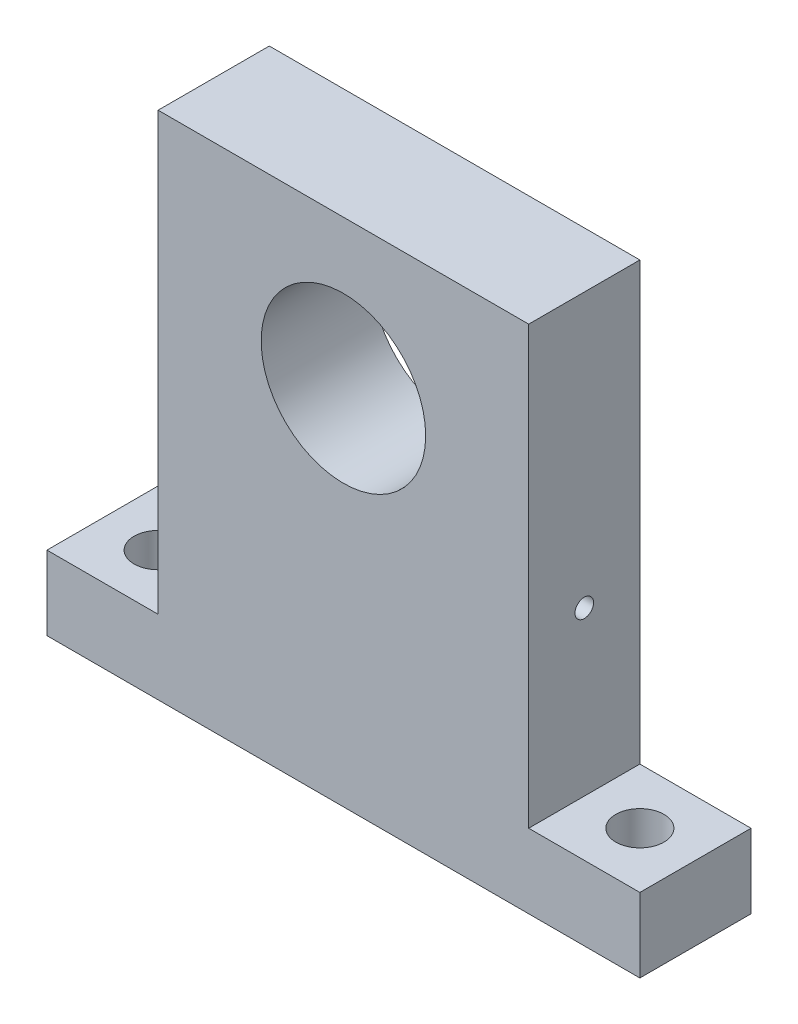
ISO-10303-21;
HEADER;
FILE_DESCRIPTION(('STEP AP214'),'2;1');
FILE_NAME('part.step','',(''),(''),'','','');
FILE_SCHEMA(('AUTOMOTIVE_DESIGN { 1 0 10303 214 1 1 1 1 }'));
ENDSEC;
DATA;
#1=APPLICATION_CONTEXT('core data for automotive mechanical design processes');
#2=APPLICATION_PROTOCOL_DEFINITION('international standard','automotive_design',2000,#1);
#3=PRODUCT_CONTEXT('',#1,'mechanical');
#4=PRODUCT('Part','Part','',(#3));
#5=PRODUCT_RELATED_PRODUCT_CATEGORY('part','',(#4));
#6=PRODUCT_DEFINITION_FORMATION('','',#4);
#7=PRODUCT_DEFINITION_CONTEXT('part definition',#1,'design');
#8=PRODUCT_DEFINITION('design','',#6,#7);
#9=PRODUCT_DEFINITION_SHAPE('','',#8);
#10=(LENGTH_UNIT() NAMED_UNIT(*) SI_UNIT(.MILLI.,.METRE.));
#11=(NAMED_UNIT(*) PLANE_ANGLE_UNIT() SI_UNIT($,.RADIAN.));
#12=(NAMED_UNIT(*) SI_UNIT($,.STERADIAN.) SOLID_ANGLE_UNIT());
#13=UNCERTAINTY_MEASURE_WITH_UNIT(LENGTH_MEASURE(1.E-05),#10,'distance_accuracy_value','');
#14=(GEOMETRIC_REPRESENTATION_CONTEXT(3) GLOBAL_UNCERTAINTY_ASSIGNED_CONTEXT((#13)) GLOBAL_UNIT_ASSIGNED_CONTEXT((#10,
#11,#12)) REPRESENTATION_CONTEXT('',''));
#15=CARTESIAN_POINT('',(0.,0.,0.));
#16=DIRECTION('',(0.,0.,1.));
#17=DIRECTION('',(1.,0.,0.));
#18=AXIS2_PLACEMENT_3D('',#15,#16,#17);
#19=CARTESIAN_POINT('',(4.44089209850063E-13,1.38777878078145E-13,15.0000000000001));
#20=DIRECTION('',(0.,0.,1.));
#21=DIRECTION('',(1.,0.,0.));
#22=AXIS2_PLACEMENT_3D('',#19,#20,#21);
#23=PLANE('',#22);
#24=DIRECTION('',(0.,1.,0.));
#25=VECTOR('',#24,1.);
#26=CARTESIAN_POINT('',(40.0000000000001,1.38777878078145E-13,15.));
#27=LINE('',#26,#25);
#28=CARTESIAN_POINT('',(40.0000000000001,1.38777878078145E-13,15.));
#29=VERTEX_POINT('',#28);
#30=CARTESIAN_POINT('',(40.0000000000005,10.0000000000001,15.));
#31=VERTEX_POINT('',#30);
#32=EDGE_CURVE('E153',#29,#31,#27,.T.);
#33=ORIENTED_EDGE('',*,*,#32,.T.);
#34=DIRECTION('',(-0.999999999999999,0.,0.));
#35=VECTOR('',#34,1.);
#36=CARTESIAN_POINT('',(40.0000000000005,10.0000000000001,15.));
#37=LINE('',#36,#35);
#38=CARTESIAN_POINT('',(25.0000000000001,9.99999999999998,14.9999999999999));
#39=VERTEX_POINT('',#38);
#40=EDGE_CURVE('E101',#31,#39,#37,.T.);
#41=ORIENTED_EDGE('',*,*,#40,.T.);
#42=DIRECTION('',(0.,1.,0.));
#43=VECTOR('',#42,1.);
#44=CARTESIAN_POINT('',(25.0000000000001,9.99999999999998,14.9999999999999));
#45=LINE('',#44,#43);
#46=CARTESIAN_POINT('',(25.0000000000001,68.9056000000001,14.9999999999999));
#47=VERTEX_POINT('',#46);
#48=EDGE_CURVE('E168',#39,#47,#45,.T.);
#49=ORIENTED_EDGE('',*,*,#48,.T.);
#50=DIRECTION('',(-1.,0.,0.));
#51=VECTOR('',#50,1.);
#52=CARTESIAN_POINT('',(25.0000000000001,68.9056000000001,14.9999999999999));
#53=LINE('',#52,#51);
#54=CARTESIAN_POINT('',(-24.9999999999998,68.9056000000001,14.9999999999998));
#55=VERTEX_POINT('',#54);
#56=EDGE_CURVE('E181',#47,#55,#53,.T.);
#57=ORIENTED_EDGE('',*,*,#56,.T.);
#58=DIRECTION('',(0.,-1.,0.));
#59=VECTOR('',#58,1.);
#60=CARTESIAN_POINT('',(-24.9999999999998,68.9056000000001,14.9999999999998));
#61=LINE('',#60,#59);
#62=CARTESIAN_POINT('',(-24.9999999999999,10.0000000000001,15.0000000000002));
#63=VERTEX_POINT('',#62);
#64=EDGE_CURVE('E120',#55,#63,#61,.T.);
#65=ORIENTED_EDGE('',*,*,#64,.T.);
#66=DIRECTION('',(-1.,0.,0.));
#67=VECTOR('',#66,1.);
#68=CARTESIAN_POINT('',(-24.9999999999999,10.0000000000001,15.0000000000002));
#69=LINE('',#68,#67);
#70=CARTESIAN_POINT('',(-39.9999999999994,10.0000000000002,14.9999999999998));
#71=VERTEX_POINT('',#70);
#72=EDGE_CURVE('E114',#63,#71,#69,.T.);
#73=ORIENTED_EDGE('',*,*,#72,.T.);
#74=DIRECTION('',(0.,-1.,0.));
#75=VECTOR('',#74,1.);
#76=CARTESIAN_POINT('',(-39.9999999999994,10.0000000000002,14.9999999999998));
#77=LINE('',#76,#75);
#78=CARTESIAN_POINT('',(-40.,2.22044604925031E-13,14.9999999999999));
#79=VERTEX_POINT('',#78);
#80=EDGE_CURVE('E118',#71,#79,#77,.T.);
#81=ORIENTED_EDGE('',*,*,#80,.T.);
#82=DIRECTION('',(1.,0.,0.));
#83=VECTOR('',#82,1.);
#84=CARTESIAN_POINT('',(-40.,2.22044604925031E-13,14.9999999999999));
#85=LINE('',#84,#83);
#86=EDGE_CURVE('E58',#79,#29,#85,.T.);
#87=ORIENTED_EDGE('',*,*,#86,.T.);
#88=EDGE_LOOP('',(#33,#41,#49,#57,#65,#73,#81,#87));
#89=FACE_BOUND('',#88,.T.);
#90=CARTESIAN_POINT('',(6.66133814775094E-13,48.9056,15.));
#91=DIRECTION('',(0.,0.,1.));
#92=DIRECTION('',(1.,0.,0.));
#93=AXIS2_PLACEMENT_3D('',#90,#91,#92);
#94=CIRCLE('',#93,11.0998);
#95=CARTESIAN_POINT('',(11.0998000000007,48.9056,15.));
#96=VERTEX_POINT('',#95);
#97=EDGE_CURVE('E142',#96,#96,#94,.T.);
#98=ORIENTED_EDGE('',*,*,#97,.F.);
#99=EDGE_LOOP('',(#98));
#100=FACE_BOUND('',#99,.T.);
#101=ADVANCED_FACE('F41',(#89,#100),#23,.T.);
#102=CARTESIAN_POINT('',(0.,0.,0.));
#103=DIRECTION('',(0.,0.,1.));
#104=DIRECTION('',(1.,0.,0.));
#105=AXIS2_PLACEMENT_3D('',#102,#103,#104);
#106=PLANE('',#105);
#107=DIRECTION('',(0.,1.,0.));
#108=VECTOR('',#107,1.);
#109=CARTESIAN_POINT('',(40.0000000000004,1.38777878078145E-13,-3.33066907387547E-13));
#110=LINE('',#109,#108);
#111=CARTESIAN_POINT('',(40.0000000000004,1.38777878078145E-13,-3.33066907387547E-13));
#112=VERTEX_POINT('',#111);
#113=CARTESIAN_POINT('',(40.,9.9999999999999,0.));
#114=VERTEX_POINT('',#113);
#115=EDGE_CURVE('E138',#112,#114,#110,.T.);
#116=ORIENTED_EDGE('',*,*,#115,.F.);
#117=DIRECTION('',(1.,0.,0.));
#118=VECTOR('',#117,1.);
#119=CARTESIAN_POINT('',(-39.9999999999999,-1.66533453693773E-13,0.));
#120=LINE('',#119,#118);
#121=CARTESIAN_POINT('',(-39.9999999999999,-1.66533453693773E-13,0.));
#122=VERTEX_POINT('',#121);
#123=EDGE_CURVE('E93',#122,#112,#120,.T.);
#124=ORIENTED_EDGE('',*,*,#123,.F.);
#125=DIRECTION('',(0.,-1.,0.));
#126=VECTOR('',#125,1.);
#127=CARTESIAN_POINT('',(-39.9999999999994,10.,1.66533453693773E-13));
#128=LINE('',#127,#126);
#129=CARTESIAN_POINT('',(-39.9999999999994,10.,1.66533453693773E-13));
#130=VERTEX_POINT('',#129);
#131=EDGE_CURVE('E87',#130,#122,#128,.T.);
#132=ORIENTED_EDGE('',*,*,#131,.F.);
#133=DIRECTION('',(-1.,0.,0.));
#134=VECTOR('',#133,1.);
#135=CARTESIAN_POINT('',(-25.,10.,0.));
#136=LINE('',#135,#134);
#137=CARTESIAN_POINT('',(-25.,10.,0.));
#138=VERTEX_POINT('',#137);
#139=EDGE_CURVE('E128',#138,#130,#136,.T.);
#140=ORIENTED_EDGE('',*,*,#139,.F.);
#141=DIRECTION('',(0.,-1.,0.));
#142=VECTOR('',#141,1.);
#143=CARTESIAN_POINT('',(-25.0000000000001,68.9056000000002,-2.22044604925031E-13));
#144=LINE('',#143,#142);
#145=CARTESIAN_POINT('',(-25.0000000000001,68.9056000000002,-2.22044604925031E-13));
#146=VERTEX_POINT('',#145);
#147=EDGE_CURVE('E148',#146,#138,#144,.T.);
#148=ORIENTED_EDGE('',*,*,#147,.F.);
#149=DIRECTION('',(-1.,0.,0.));
#150=VECTOR('',#149,1.);
#151=CARTESIAN_POINT('',(25.,68.9056,0.));
#152=LINE('',#151,#150);
#153=CARTESIAN_POINT('',(25.,68.9056,0.));
#154=VERTEX_POINT('',#153);
#155=EDGE_CURVE('E146',#154,#146,#152,.T.);
#156=ORIENTED_EDGE('',*,*,#155,.F.);
#157=DIRECTION('',(0.,1.,0.));
#158=VECTOR('',#157,1.);
#159=CARTESIAN_POINT('',(25.0000000000006,10.0000000000001,0.));
#160=LINE('',#159,#158);
#161=CARTESIAN_POINT('',(25.0000000000006,10.0000000000001,0.));
#162=VERTEX_POINT('',#161);
#163=EDGE_CURVE('E144',#162,#154,#160,.T.);
#164=ORIENTED_EDGE('',*,*,#163,.F.);
#165=DIRECTION('',(-0.999999999999999,0.,0.));
#166=VECTOR('',#165,1.);
#167=CARTESIAN_POINT('',(40.,9.9999999999999,0.));
#168=LINE('',#167,#166);
#169=EDGE_CURVE('E141',#114,#162,#168,.T.);
#170=ORIENTED_EDGE('',*,*,#169,.F.);
#171=EDGE_LOOP('',(#116,#124,#132,#140,#148,#156,#164,#170));
#172=FACE_BOUND('',#171,.T.);
#173=CARTESIAN_POINT('',(0.,48.9055999999999,-1.11022302462516E-13));
#174=DIRECTION('',(0.,0.,1.));
#175=DIRECTION('',(1.,0.,0.));
#176=AXIS2_PLACEMENT_3D('',#173,#174,#175);
#177=CIRCLE('',#176,11.0998);
#178=CARTESIAN_POINT('',(11.0998,48.9055999999999,-1.2519404402056E-13));
#179=VERTEX_POINT('',#178);
#180=EDGE_CURVE('E187',#179,#179,#177,.T.);
#181=ORIENTED_EDGE('',*,*,#180,.T.);
#182=EDGE_LOOP('',(#181));
#183=FACE_BOUND('',#182,.T.);
#184=ADVANCED_FACE('F172',(#172,#183),#106,.F.);
#185=CARTESIAN_POINT('',(40.0000000000001,1.38777878078145E-13,15.));
#186=DIRECTION('',(-1.,0.,0.));
#187=DIRECTION('',(0.,0.,1.));
#188=AXIS2_PLACEMENT_3D('',#185,#186,#187);
#189=PLANE('',#188);
#190=ORIENTED_EDGE('',*,*,#115,.T.);
#191=DIRECTION('',(0.,0.,-1.));
#192=VECTOR('',#191,1.);
#193=CARTESIAN_POINT('',(40.0000000000005,10.0000000000001,15.));
#194=LINE('',#193,#192);
#195=EDGE_CURVE('E11',#31,#114,#194,.T.);
#196=ORIENTED_EDGE('',*,*,#195,.F.);
#197=ORIENTED_EDGE('',*,*,#32,.F.);
#198=DIRECTION('',(0.,0.,-1.));
#199=VECTOR('',#198,1.);
#200=CARTESIAN_POINT('',(40.0000000000001,1.38777878078145E-13,15.));
#201=LINE('',#200,#199);
#202=EDGE_CURVE('E134',#29,#112,#201,.T.);
#203=ORIENTED_EDGE('',*,*,#202,.T.);
#204=EDGE_LOOP('',(#190,#196,#197,#203));
#205=FACE_BOUND('',#204,.T.);
#206=ADVANCED_FACE('F43',(#205),#189,.F.);
#207=CARTESIAN_POINT('',(40.0000000000005,10.0000000000001,15.));
#208=DIRECTION('',(0.,-1.,0.));
#209=DIRECTION('',(0.999999999999999,0.,0.));
#210=AXIS2_PLACEMENT_3D('',#207,#208,#209);
#211=PLANE('',#210);
#212=CARTESIAN_POINT('',(32.5000000000002,10.0000000000001,7.4999999999999));
#213=DIRECTION('',(0.,1.,0.));
#214=DIRECTION('',(-0.999999999999999,0.,0.));
#215=AXIS2_PLACEMENT_3D('',#212,#213,#214);
#216=CIRCLE('',#215,3.25);
#217=CARTESIAN_POINT('',(29.2500000000004,10.0000000000001,7.50000000000012));
#218=VERTEX_POINT('',#217);
#219=EDGE_CURVE('E196',#218,#218,#216,.T.);
#220=ORIENTED_EDGE('',*,*,#219,.F.);
#221=EDGE_LOOP('',(#220));
#222=FACE_BOUND('',#221,.T.);
#223=ORIENTED_EDGE('',*,*,#169,.T.);
#224=DIRECTION('',(0.,0.,-1.));
#225=VECTOR('',#224,1.);
#226=CARTESIAN_POINT('',(25.0000000000001,9.99999999999998,14.9999999999999));
#227=LINE('',#226,#225);
#228=EDGE_CURVE('E50',#39,#162,#227,.T.);
#229=ORIENTED_EDGE('',*,*,#228,.F.);
#230=ORIENTED_EDGE('',*,*,#40,.F.);
#231=ORIENTED_EDGE('',*,*,#195,.T.);
#232=EDGE_LOOP('',(#223,#229,#230,#231));
#233=FACE_BOUND('',#232,.T.);
#234=ADVANCED_FACE('F221',(#222,#233),#211,.F.);
#235=CARTESIAN_POINT('',(25.0000000000001,9.99999999999998,14.9999999999999));
#236=DIRECTION('',(-1.,0.,0.));
#237=DIRECTION('',(0.,-1.,0.));
#238=AXIS2_PLACEMENT_3D('',#235,#236,#237);
#239=PLANE('',#238);
#240=CARTESIAN_POINT('',(25.,32.,7.50000000000001));
#241=DIRECTION('',(1.,0.,0.));
#242=DIRECTION('',(0.,1.,0.));
#243=AXIS2_PLACEMENT_3D('',#240,#241,#242);
#244=CIRCLE('',#243,1.25);
#245=CARTESIAN_POINT('',(25.,33.25,7.49999999999989));
#246=VERTEX_POINT('',#245);
#247=EDGE_CURVE('E205',#246,#246,#244,.T.);
#248=ORIENTED_EDGE('',*,*,#247,.F.);
#249=EDGE_LOOP('',(#248));
#250=FACE_BOUND('',#249,.T.);
#251=ORIENTED_EDGE('',*,*,#163,.T.);
#252=DIRECTION('',(0.,0.,-1.));
#253=VECTOR('',#252,1.);
#254=CARTESIAN_POINT('',(25.0000000000001,68.9056000000001,14.9999999999999));
#255=LINE('',#254,#253);
#256=EDGE_CURVE('E160',#47,#154,#255,.T.);
#257=ORIENTED_EDGE('',*,*,#256,.F.);
#258=ORIENTED_EDGE('',*,*,#48,.F.);
#259=ORIENTED_EDGE('',*,*,#228,.T.);
#260=EDGE_LOOP('',(#251,#257,#258,#259));
#261=FACE_BOUND('',#260,.T.);
#262=ADVANCED_FACE('F166',(#250,#261),#239,.F.);
#263=CARTESIAN_POINT('',(25.0000000000001,68.9056000000001,14.9999999999999));
#264=DIRECTION('',(0.,-1.,0.));
#265=DIRECTION('',(0.,0.,-1.));
#266=AXIS2_PLACEMENT_3D('',#263,#264,#265);
#267=PLANE('',#266);
#268=ORIENTED_EDGE('',*,*,#155,.T.);
#269=DIRECTION('',(0.,0.,-1.));
#270=VECTOR('',#269,1.);
#271=CARTESIAN_POINT('',(-24.9999999999998,68.9056000000001,14.9999999999998));
#272=LINE('',#271,#270);
#273=EDGE_CURVE('E157',#55,#146,#272,.T.);
#274=ORIENTED_EDGE('',*,*,#273,.F.);
#275=ORIENTED_EDGE('',*,*,#56,.F.);
#276=ORIENTED_EDGE('',*,*,#256,.T.);
#277=EDGE_LOOP('',(#268,#274,#275,#276));
#278=FACE_BOUND('',#277,.T.);
#279=ADVANCED_FACE('F177',(#278),#267,.F.);
#280=CARTESIAN_POINT('',(-24.9999999999998,68.9056000000001,14.9999999999998));
#281=DIRECTION('',(1.,0.,0.));
#282=DIRECTION('',(0.,1.,0.));
#283=AXIS2_PLACEMENT_3D('',#280,#281,#282);
#284=PLANE('',#283);
#285=ORIENTED_EDGE('',*,*,#147,.T.);
#286=DIRECTION('',(0.,0.,-1.));
#287=VECTOR('',#286,1.);
#288=CARTESIAN_POINT('',(-24.9999999999999,10.0000000000001,15.0000000000002));
#289=LINE('',#288,#287);
#290=EDGE_CURVE('E129',#63,#138,#289,.T.);
#291=ORIENTED_EDGE('',*,*,#290,.F.);
#292=ORIENTED_EDGE('',*,*,#64,.F.);
#293=ORIENTED_EDGE('',*,*,#273,.T.);
#294=EDGE_LOOP('',(#285,#291,#292,#293));
#295=FACE_BOUND('',#294,.T.);
#296=ADVANCED_FACE('F180',(#295),#284,.F.);
#297=CARTESIAN_POINT('',(-24.9999999999999,10.0000000000001,15.0000000000002));
#298=DIRECTION('',(0.,-1.,0.));
#299=DIRECTION('',(1.,0.,0.));
#300=AXIS2_PLACEMENT_3D('',#297,#298,#299);
#301=PLANE('',#300);
#302=CARTESIAN_POINT('',(-32.5000000000001,10.0000000000001,7.50000000000001));
#303=DIRECTION('',(0.,1.,0.));
#304=DIRECTION('',(-0.999999999999999,0.,0.));
#305=AXIS2_PLACEMENT_3D('',#302,#303,#304);
#306=CIRCLE('',#305,3.25);
#307=CARTESIAN_POINT('',(-35.75,10.0000000000001,7.50000000000001));
#308=VERTEX_POINT('',#307);
#309=EDGE_CURVE('E200',#308,#308,#306,.T.);
#310=ORIENTED_EDGE('',*,*,#309,.F.);
#311=EDGE_LOOP('',(#310));
#312=FACE_BOUND('',#311,.T.);
#313=ORIENTED_EDGE('',*,*,#139,.T.);
#314=DIRECTION('',(0.,0.,-1.));
#315=VECTOR('',#314,1.);
#316=CARTESIAN_POINT('',(-39.9999999999994,10.0000000000002,14.9999999999998));
#317=LINE('',#316,#315);
#318=EDGE_CURVE('E125',#71,#130,#317,.T.);
#319=ORIENTED_EDGE('',*,*,#318,.F.);
#320=ORIENTED_EDGE('',*,*,#72,.F.);
#321=ORIENTED_EDGE('',*,*,#290,.T.);
#322=EDGE_LOOP('',(#313,#319,#320,#321));
#323=FACE_BOUND('',#322,.T.);
#324=ADVANCED_FACE('F126',(#312,#323),#301,.F.);
#325=CARTESIAN_POINT('',(-39.9999999999994,10.0000000000002,14.9999999999998));
#326=DIRECTION('',(1.,0.,0.));
#327=DIRECTION('',(0.,0.,-1.));
#328=AXIS2_PLACEMENT_3D('',#325,#326,#327);
#329=PLANE('',#328);
#330=ORIENTED_EDGE('',*,*,#131,.T.);
#331=DIRECTION('',(0.,0.,-1.));
#332=VECTOR('',#331,1.);
#333=CARTESIAN_POINT('',(-40.,2.22044604925031E-13,14.9999999999999));
#334=LINE('',#333,#332);
#335=EDGE_CURVE('E130',#79,#122,#334,.T.);
#336=ORIENTED_EDGE('',*,*,#335,.F.);
#337=ORIENTED_EDGE('',*,*,#80,.F.);
#338=ORIENTED_EDGE('',*,*,#318,.T.);
#339=EDGE_LOOP('',(#330,#336,#337,#338));
#340=FACE_BOUND('',#339,.T.);
#341=ADVANCED_FACE('F132',(#340),#329,.F.);
#342=CARTESIAN_POINT('',(-40.,2.22044604925031E-13,14.9999999999999));
#343=DIRECTION('',(0.,1.,0.));
#344=DIRECTION('',(0.,0.,1.));
#345=AXIS2_PLACEMENT_3D('',#342,#343,#344);
#346=PLANE('',#345);
#347=CARTESIAN_POINT('',(-32.5,0.,7.50000000000001));
#348=DIRECTION('',(0.,1.,0.));
#349=DIRECTION('',(-0.999999999999999,0.,0.));
#350=AXIS2_PLACEMENT_3D('',#347,#348,#349);
#351=CIRCLE('',#350,3.25);
#352=CARTESIAN_POINT('',(-35.75,0.,7.50000000000001));
#353=VERTEX_POINT('',#352);
#354=EDGE_CURVE('E190',#353,#353,#351,.T.);
#355=ORIENTED_EDGE('',*,*,#354,.T.);
#356=EDGE_LOOP('',(#355));
#357=FACE_BOUND('',#356,.T.);
#358=CARTESIAN_POINT('',(32.5000000000004,0.,7.50000000000012));
#359=DIRECTION('',(0.,1.,0.));
#360=DIRECTION('',(-0.999999999999999,0.,0.));
#361=AXIS2_PLACEMENT_3D('',#358,#359,#360);
#362=CIRCLE('',#361,3.25);
#363=CARTESIAN_POINT('',(29.2500000000004,0.,7.50000000000012));
#364=VERTEX_POINT('',#363);
#365=EDGE_CURVE('E193',#364,#364,#362,.T.);
#366=ORIENTED_EDGE('',*,*,#365,.T.);
#367=EDGE_LOOP('',(#366));
#368=FACE_BOUND('',#367,.T.);
#369=ORIENTED_EDGE('',*,*,#123,.T.);
#370=ORIENTED_EDGE('',*,*,#202,.F.);
#371=ORIENTED_EDGE('',*,*,#86,.F.);
#372=ORIENTED_EDGE('',*,*,#335,.T.);
#373=EDGE_LOOP('',(#369,#370,#371,#372));
#374=FACE_BOUND('',#373,.T.);
#375=ADVANCED_FACE('F239',(#357,#368,#374),#346,.F.);
#376=CARTESIAN_POINT('',(6.66133814775094E-13,48.9056,15.));
#377=DIRECTION('',(0.,0.,-1.));
#378=DIRECTION('',(-1.,0.,0.));
#379=AXIS2_PLACEMENT_3D('',#376,#377,#378);
#380=CYLINDRICAL_SURFACE('',#379,11.0998);
#381=ORIENTED_EDGE('',*,*,#97,.T.);
#382=EDGE_LOOP('',(#381));
#383=FACE_BOUND('',#382,.T.);
#384=ORIENTED_EDGE('',*,*,#180,.F.);
#385=EDGE_LOOP('',(#384));
#386=FACE_BOUND('',#385,.T.);
#387=ADVANCED_FACE('F236',(#383,#386),#380,.F.);
#388=CARTESIAN_POINT('',(32.5000000000004,0.,7.50000000000012));
#389=DIRECTION('',(0.,1.,0.));
#390=DIRECTION('',(-0.999999999999999,0.,0.));
#391=AXIS2_PLACEMENT_3D('',#388,#389,#390);
#392=CYLINDRICAL_SURFACE('',#391,3.25);
#393=CARTESIAN_POINT('',(29.2500000000004,0.,7.50000000000012));
#394=CARTESIAN_POINT('',(29.2500000000004,0.104166666666697,7.50000000000012));
#395=CARTESIAN_POINT('',(29.2500000000004,0.208333333333364,7.50000000000012));
#396=CARTESIAN_POINT('',(29.2500000000004,0.416666666666698,7.50000000000012));
#397=CARTESIAN_POINT('',(29.2500000000004,0.520833333333365,7.50000000000012));
#398=CARTESIAN_POINT('',(29.2500000000004,0.729166666666699,7.50000000000012));
#399=CARTESIAN_POINT('',(29.2500000000004,0.833333333333366,7.50000000000012));
#400=CARTESIAN_POINT('',(29.2500000000004,1.0416666666667,7.50000000000012));
#401=CARTESIAN_POINT('',(29.2500000000004,1.14583333333337,7.50000000000012));
#402=CARTESIAN_POINT('',(29.2500000000004,1.3541666666667,7.50000000000012));
#403=CARTESIAN_POINT('',(29.2500000000004,1.45833333333337,7.50000000000012));
#404=CARTESIAN_POINT('',(29.2500000000004,1.6666666666667,7.50000000000012));
#405=CARTESIAN_POINT('',(29.2500000000004,1.77083333333337,7.50000000000012));
#406=CARTESIAN_POINT('',(29.2500000000004,1.9791666666667,7.50000000000012));
#407=CARTESIAN_POINT('',(29.2500000000004,2.08333333333337,7.50000000000012));
#408=CARTESIAN_POINT('',(29.2500000000004,2.2916666666667,7.50000000000012));
#409=CARTESIAN_POINT('',(29.2500000000004,2.39583333333337,7.50000000000012));
#410=CARTESIAN_POINT('',(29.2500000000004,2.60416666666671,7.50000000000012));
#411=CARTESIAN_POINT('',(29.2500000000004,2.70833333333337,7.50000000000012));
#412=CARTESIAN_POINT('',(29.2500000000004,2.91666666666671,7.50000000000012));
#413=CARTESIAN_POINT('',(29.2500000000004,3.02083333333337,7.50000000000012));
#414=CARTESIAN_POINT('',(29.2500000000004,3.22916666666671,7.50000000000012));
#415=CARTESIAN_POINT('',(29.2500000000004,3.33333333333338,7.50000000000012));
#416=CARTESIAN_POINT('',(29.2500000000004,3.54166666666671,7.50000000000012));
#417=CARTESIAN_POINT('',(29.2500000000004,3.64583333333338,7.50000000000012));
#418=CARTESIAN_POINT('',(29.2500000000004,3.85416666666671,7.50000000000012));
#419=CARTESIAN_POINT('',(29.2500000000004,3.95833333333338,7.50000000000012));
#420=CARTESIAN_POINT('',(29.2500000000004,4.16666666666671,7.50000000000012));
#421=CARTESIAN_POINT('',(29.2500000000004,4.27083333333338,7.50000000000012));
#422=CARTESIAN_POINT('',(29.2500000000004,4.47916666666671,7.50000000000012));
#423=CARTESIAN_POINT('',(29.2500000000004,4.58333333333338,7.50000000000012));
#424=CARTESIAN_POINT('',(29.2500000000004,4.79166666666671,7.50000000000012));
#425=CARTESIAN_POINT('',(29.2500000000004,4.89583333333338,7.50000000000012));
#426=CARTESIAN_POINT('',(29.2500000000004,5.10416666666672,7.50000000000012));
#427=CARTESIAN_POINT('',(29.2500000000004,5.20833333333338,7.50000000000012));
#428=CARTESIAN_POINT('',(29.2500000000004,5.41666666666672,7.50000000000012));
#429=CARTESIAN_POINT('',(29.2500000000004,5.52083333333338,7.50000000000012));
#430=CARTESIAN_POINT('',(29.2500000000004,5.72916666666672,7.50000000000012));
#431=CARTESIAN_POINT('',(29.2500000000004,5.83333333333338,7.50000000000012));
#432=CARTESIAN_POINT('',(29.2500000000004,6.04166666666672,7.50000000000012));
#433=CARTESIAN_POINT('',(29.2500000000004,6.14583333333339,7.50000000000012));
#434=CARTESIAN_POINT('',(29.2500000000004,6.35416666666672,7.50000000000012));
#435=CARTESIAN_POINT('',(29.2500000000004,6.45833333333339,7.50000000000012));
#436=CARTESIAN_POINT('',(29.2500000000004,6.66666666666672,7.50000000000012));
#437=CARTESIAN_POINT('',(29.2500000000004,6.77083333333339,7.50000000000012));
#438=CARTESIAN_POINT('',(29.2500000000004,6.97916666666672,7.50000000000012));
#439=CARTESIAN_POINT('',(29.2500000000004,7.08333333333339,7.50000000000012));
#440=CARTESIAN_POINT('',(29.2500000000004,7.29166666666672,7.50000000000012));
#441=CARTESIAN_POINT('',(29.2500000000004,7.39583333333339,7.50000000000012));
#442=CARTESIAN_POINT('',(29.2500000000004,7.60416666666673,7.50000000000012));
#443=CARTESIAN_POINT('',(29.2500000000004,7.70833333333339,7.50000000000012));
#444=CARTESIAN_POINT('',(29.2500000000004,7.91666666666673,7.50000000000012));
#445=CARTESIAN_POINT('',(29.2500000000004,8.02083333333339,7.50000000000012));
#446=CARTESIAN_POINT('',(29.2500000000004,8.22916666666673,7.50000000000012));
#447=CARTESIAN_POINT('',(29.2500000000004,8.33333333333339,7.50000000000012));
#448=CARTESIAN_POINT('',(29.2500000000004,8.54166666666673,7.50000000000012));
#449=CARTESIAN_POINT('',(29.2500000000004,8.6458333333334,7.50000000000012));
#450=CARTESIAN_POINT('',(29.2500000000004,8.85416666666673,7.50000000000012));
#451=CARTESIAN_POINT('',(29.2500000000004,8.9583333333334,7.50000000000012));
#452=CARTESIAN_POINT('',(29.2500000000004,9.16666666666673,7.50000000000012));
#453=CARTESIAN_POINT('',(29.2500000000004,9.2708333333334,7.50000000000012));
#454=CARTESIAN_POINT('',(29.2500000000004,9.47916666666673,7.50000000000012));
#455=CARTESIAN_POINT('',(29.2500000000004,9.5833333333334,7.50000000000012));
#456=CARTESIAN_POINT('',(29.2500000000004,9.79166666666673,7.50000000000012));
#457=CARTESIAN_POINT('',(29.2500000000004,9.8958333333334,7.50000000000012));
#458=CARTESIAN_POINT('',(29.2500000000004,10.0000000000001,7.50000000000012));
#459=B_SPLINE_CURVE_WITH_KNOTS('',3,(#393,#394,#395,#396,#397,#398,#399,#400,#401,#402,#403,
#404,#405,#406,#407,#408,#409,#410,#411,#412,#413,#414,#415,#416,#417,#418,#419,#420,#421,#422,
#423,#424,#425,#426,#427,#428,#429,#430,#431,#432,#433,#434,#435,#436,#437,#438,#439,#440,#441,
#442,#443,#444,#445,#446,#447,#448,#449,#450,#451,#452,#453,#454,#455,#456,#457,#458),
.UNSPECIFIED.,.F.,.F.,(4,2,2,2,2,2,2,2,2,2,2,2,2,2,2,2,2,2,2,2,2,2,2,2,2,2,2,2,2,2,2,2,4),(0.,
0.312500000000001,0.625000000000002,0.937500000000004,1.25000000000001,1.56250000000001,
1.87500000000001,2.18750000000001,2.50000000000001,2.81250000000001,3.12500000000001,
3.43750000000001,3.75000000000001,4.06250000000002,4.37500000000002,4.68750000000002,
5.00000000000002,5.31250000000002,5.62500000000002,5.93750000000002,6.25000000000002,
6.56250000000003,6.87500000000003,7.18750000000003,7.50000000000003,7.81250000000003,
8.12500000000003,8.43750000000003,8.75000000000003,9.06250000000003,9.37500000000004,
9.68750000000004,10.),.UNSPECIFIED.);
#460=EDGE_CURVE('BSEAM275',#364,#218,#459,.T.);
#461=ORIENTED_EDGE('',*,*,#365,.F.);
#462=ORIENTED_EDGE('',*,*,#219,.T.);
#463=ORIENTED_EDGE('',*,*,#460,.T.);
#464=ORIENTED_EDGE('',*,*,#460,.F.);
#465=EDGE_LOOP('',(#461,#463,#462,#464));
#466=FACE_BOUND('',#465,.T.);
#467=ADVANCED_FACE('F275',(#466),#392,.F.);
#468=CARTESIAN_POINT('',(-32.5,0.,7.50000000000001));
#469=DIRECTION('',(0.,1.,0.));
#470=DIRECTION('',(-0.999999999999999,0.,0.));
#471=AXIS2_PLACEMENT_3D('',#468,#469,#470);
#472=CYLINDRICAL_SURFACE('',#471,3.25);
#473=CARTESIAN_POINT('',(-35.75,0.,7.50000000000001));
#474=CARTESIAN_POINT('',(-35.75,0.104166666666642,7.50000000000001));
#475=CARTESIAN_POINT('',(-35.75,0.208333333333309,7.50000000000001));
#476=CARTESIAN_POINT('',(-35.75,0.416666666666645,7.50000000000001));
#477=CARTESIAN_POINT('',(-35.75,0.520833333333312,7.50000000000001));
#478=CARTESIAN_POINT('',(-35.75,0.729166666666648,7.50000000000001));
#479=CARTESIAN_POINT('',(-35.75,0.833333333333315,7.50000000000001));
#480=CARTESIAN_POINT('',(-35.75,1.04166666666665,7.50000000000001));
#481=CARTESIAN_POINT('',(-35.75,1.14583333333332,7.50000000000001));
#482=CARTESIAN_POINT('',(-35.75,1.35416666666665,7.50000000000001));
#483=CARTESIAN_POINT('',(-35.75,1.45833333333332,7.50000000000001));
#484=CARTESIAN_POINT('',(-35.75,1.66666666666666,7.50000000000001));
#485=CARTESIAN_POINT('',(-35.75,1.77083333333332,7.50000000000001));
#486=CARTESIAN_POINT('',(-35.75,1.97916666666666,7.50000000000001));
#487=CARTESIAN_POINT('',(-35.75,2.08333333333333,7.50000000000001));
#488=CARTESIAN_POINT('',(-35.75,2.29166666666666,7.50000000000001));
#489=CARTESIAN_POINT('',(-35.75,2.39583333333333,7.50000000000001));
#490=CARTESIAN_POINT('',(-35.75,2.60416666666667,7.50000000000001));
#491=CARTESIAN_POINT('',(-35.75,2.70833333333333,7.50000000000001));
#492=CARTESIAN_POINT('',(-35.75,2.91666666666667,7.50000000000001));
#493=CARTESIAN_POINT('',(-35.75,3.02083333333334,7.50000000000001));
#494=CARTESIAN_POINT('',(-35.75,3.22916666666667,7.50000000000001));
#495=CARTESIAN_POINT('',(-35.75,3.33333333333334,7.50000000000001));
#496=CARTESIAN_POINT('',(-35.75,3.54166666666667,7.50000000000001));
#497=CARTESIAN_POINT('',(-35.75,3.64583333333334,7.50000000000001));
#498=CARTESIAN_POINT('',(-35.75,3.85416666666668,7.50000000000001));
#499=CARTESIAN_POINT('',(-35.75,3.95833333333335,7.50000000000001));
#500=CARTESIAN_POINT('',(-35.75,4.16666666666668,7.50000000000001));
#501=CARTESIAN_POINT('',(-35.75,4.27083333333335,7.50000000000001));
#502=CARTESIAN_POINT('',(-35.75,4.47916666666668,7.50000000000001));
#503=CARTESIAN_POINT('',(-35.75,4.58333333333335,7.50000000000001));
#504=CARTESIAN_POINT('',(-35.75,4.79166666666669,7.50000000000001));
#505=CARTESIAN_POINT('',(-35.75,4.89583333333335,7.50000000000001));
#506=CARTESIAN_POINT('',(-35.75,5.10416666666669,7.50000000000001));
#507=CARTESIAN_POINT('',(-35.75,5.20833333333336,7.50000000000001));
#508=CARTESIAN_POINT('',(-35.75,5.41666666666669,7.50000000000001));
#509=CARTESIAN_POINT('',(-35.75,5.52083333333336,7.50000000000001));
#510=CARTESIAN_POINT('',(-35.75,5.72916666666669,7.50000000000001));
#511=CARTESIAN_POINT('',(-35.75,5.83333333333336,7.50000000000001));
#512=CARTESIAN_POINT('',(-35.75,6.0416666666667,7.50000000000001));
#513=CARTESIAN_POINT('',(-35.75,6.14583333333337,7.50000000000001));
#514=CARTESIAN_POINT('',(-35.75,6.3541666666667,7.50000000000001));
#515=CARTESIAN_POINT('',(-35.75,6.45833333333337,7.50000000000001));
#516=CARTESIAN_POINT('',(-35.75,6.6666666666667,7.50000000000001));
#517=CARTESIAN_POINT('',(-35.75,6.77083333333337,7.50000000000001));
#518=CARTESIAN_POINT('',(-35.75,6.97916666666671,7.50000000000001));
#519=CARTESIAN_POINT('',(-35.75,7.08333333333337,7.50000000000001));
#520=CARTESIAN_POINT('',(-35.75,7.29166666666671,7.50000000000001));
#521=CARTESIAN_POINT('',(-35.75,7.39583333333338,7.50000000000001));
#522=CARTESIAN_POINT('',(-35.75,7.60416666666671,7.50000000000001));
#523=CARTESIAN_POINT('',(-35.75,7.70833333333338,7.50000000000001));
#524=CARTESIAN_POINT('',(-35.75,7.91666666666671,7.50000000000001));
#525=CARTESIAN_POINT('',(-35.75,8.02083333333338,7.50000000000001));
#526=CARTESIAN_POINT('',(-35.75,8.22916666666672,7.50000000000001));
#527=CARTESIAN_POINT('',(-35.75,8.33333333333339,7.50000000000001));
#528=CARTESIAN_POINT('',(-35.75,8.54166666666672,7.50000000000001));
#529=CARTESIAN_POINT('',(-35.75,8.64583333333339,7.50000000000001));
#530=CARTESIAN_POINT('',(-35.75,8.85416666666672,7.50000000000001));
#531=CARTESIAN_POINT('',(-35.75,8.95833333333339,7.50000000000001));
#532=CARTESIAN_POINT('',(-35.75,9.16666666666673,7.50000000000001));
#533=CARTESIAN_POINT('',(-35.75,9.27083333333339,7.50000000000001));
#534=CARTESIAN_POINT('',(-35.75,9.47916666666673,7.50000000000001));
#535=CARTESIAN_POINT('',(-35.75,9.5833333333334,7.50000000000001));
#536=CARTESIAN_POINT('',(-35.75,9.79166666666673,7.50000000000001));
#537=CARTESIAN_POINT('',(-35.75,9.8958333333334,7.50000000000001));
#538=CARTESIAN_POINT('',(-35.75,10.0000000000001,7.50000000000001));
#539=B_SPLINE_CURVE_WITH_KNOTS('',3,(#473,#474,#475,#476,#477,#478,#479,#480,#481,#482,#483,
#484,#485,#486,#487,#488,#489,#490,#491,#492,#493,#494,#495,#496,#497,#498,#499,#500,#501,#502,
#503,#504,#505,#506,#507,#508,#509,#510,#511,#512,#513,#514,#515,#516,#517,#518,#519,#520,#521,
#522,#523,#524,#525,#526,#527,#528,#529,#530,#531,#532,#533,#534,#535,#536,#537,#538),
.UNSPECIFIED.,.F.,.F.,(4,2,2,2,2,2,2,2,2,2,2,2,2,2,2,2,2,2,2,2,2,2,2,2,2,2,2,2,2,2,2,2,4),(0.,
0.312500000000003,0.625000000000006,0.937500000000009,1.25000000000001,1.56250000000001,
1.87500000000002,2.18750000000002,2.50000000000002,2.81250000000003,3.12500000000003,
3.43750000000003,3.75000000000004,4.06250000000004,4.37500000000004,4.68750000000004,
5.00000000000005,5.31250000000005,5.62500000000005,5.93750000000006,6.25000000000006,
6.56250000000006,6.87500000000006,7.18750000000007,7.50000000000007,7.81250000000007,
8.12500000000008,8.43750000000008,8.75000000000008,9.06250000000009,9.37500000000009,
9.68750000000009,10.0000000000001),.UNSPECIFIED.);
#540=EDGE_CURVE('BSEAM216',#353,#308,#539,.T.);
#541=ORIENTED_EDGE('',*,*,#354,.F.);
#542=ORIENTED_EDGE('',*,*,#309,.T.);
#543=ORIENTED_EDGE('',*,*,#540,.T.);
#544=ORIENTED_EDGE('',*,*,#540,.F.);
#545=EDGE_LOOP('',(#541,#543,#542,#544));
#546=FACE_BOUND('',#545,.T.);
#547=ADVANCED_FACE('F216',(#546),#472,.F.);
#548=CARTESIAN_POINT('',(20.5000000000004,32.,7.4999999999999));
#549=DIRECTION('',(1.,0.,0.));
#550=DIRECTION('',(0.,1.,0.));
#551=AXIS2_PLACEMENT_3D('',#548,#549,#550);
#552=CYLINDRICAL_SURFACE('',#551,1.25);
#553=CARTESIAN_POINT('',(20.5000000000004,32.,7.4999999999999));
#554=DIRECTION('',(1.,0.,0.));
#555=DIRECTION('',(0.,1.,0.));
#556=AXIS2_PLACEMENT_3D('',#553,#554,#555);
#557=CIRCLE('',#556,1.25);
#558=CARTESIAN_POINT('',(20.5000000000004,33.25,7.4999999999999));
#559=VERTEX_POINT('',#558);
#560=EDGE_CURVE('E197',#559,#559,#557,.T.);
#561=CARTESIAN_POINT('',(20.5000000000004,33.25,7.4999999999999));
#562=CARTESIAN_POINT('',(20.5468750000004,33.25,7.4999999999999));
#563=CARTESIAN_POINT('',(20.5937500000004,33.25,7.4999999999999));
#564=CARTESIAN_POINT('',(20.6875000000004,33.25,7.4999999999999));
#565=CARTESIAN_POINT('',(20.7343750000004,33.25,7.4999999999999));
#566=CARTESIAN_POINT('',(20.8281250000004,33.25,7.4999999999999));
#567=CARTESIAN_POINT('',(20.8750000000004,33.25,7.4999999999999));
#568=CARTESIAN_POINT('',(20.9687500000004,33.25,7.4999999999999));
#569=CARTESIAN_POINT('',(21.0156250000004,33.25,7.4999999999999));
#570=CARTESIAN_POINT('',(21.1093750000004,33.25,7.4999999999999));
#571=CARTESIAN_POINT('',(21.1562500000004,33.25,7.4999999999999));
#572=CARTESIAN_POINT('',(21.2500000000003,33.25,7.4999999999999));
#573=CARTESIAN_POINT('',(21.2968750000003,33.25,7.4999999999999));
#574=CARTESIAN_POINT('',(21.3906250000003,33.25,7.4999999999999));
#575=CARTESIAN_POINT('',(21.4375000000003,33.25,7.49999999999989));
#576=CARTESIAN_POINT('',(21.5312500000003,33.25,7.49999999999989));
#577=CARTESIAN_POINT('',(21.5781250000003,33.25,7.49999999999989));
#578=CARTESIAN_POINT('',(21.6718750000003,33.25,7.49999999999989));
#579=CARTESIAN_POINT('',(21.7187500000003,33.25,7.49999999999989));
#580=CARTESIAN_POINT('',(21.8125000000003,33.25,7.49999999999989));
#581=CARTESIAN_POINT('',(21.8593750000003,33.25,7.49999999999989));
#582=CARTESIAN_POINT('',(21.9531250000003,33.25,7.49999999999989));
#583=CARTESIAN_POINT('',(22.0000000000003,33.25,7.49999999999989));
#584=CARTESIAN_POINT('',(22.0937500000003,33.25,7.49999999999989));
#585=CARTESIAN_POINT('',(22.1406250000003,33.25,7.49999999999989));
#586=CARTESIAN_POINT('',(22.2343750000003,33.25,7.49999999999989));
#587=CARTESIAN_POINT('',(22.2812500000003,33.25,7.49999999999989));
#588=CARTESIAN_POINT('',(22.3750000000002,33.25,7.49999999999989));
#589=CARTESIAN_POINT('',(22.4218750000002,33.25,7.49999999999989));
#590=CARTESIAN_POINT('',(22.5156250000002,33.25,7.49999999999989));
#591=CARTESIAN_POINT('',(22.5625000000002,33.25,7.49999999999989));
#592=CARTESIAN_POINT('',(22.6562500000002,33.25,7.49999999999989));
#593=CARTESIAN_POINT('',(22.7031250000002,33.25,7.49999999999989));
#594=CARTESIAN_POINT('',(22.7968750000002,33.25,7.49999999999989));
#595=CARTESIAN_POINT('',(22.8437500000002,33.25,7.49999999999989));
#596=CARTESIAN_POINT('',(22.9375000000002,33.25,7.49999999999989));
#597=CARTESIAN_POINT('',(22.9843750000002,33.25,7.49999999999989));
#598=CARTESIAN_POINT('',(23.0781250000002,33.25,7.49999999999989));
#599=CARTESIAN_POINT('',(23.1250000000002,33.25,7.49999999999989));
#600=CARTESIAN_POINT('',(23.2187500000002,33.25,7.49999999999989));
#601=CARTESIAN_POINT('',(23.2656250000002,33.25,7.49999999999989));
#602=CARTESIAN_POINT('',(23.3593750000002,33.25,7.49999999999989));
#603=CARTESIAN_POINT('',(23.4062500000002,33.25,7.49999999999989));
#604=CARTESIAN_POINT('',(23.5000000000002,33.25,7.49999999999989));
#605=CARTESIAN_POINT('',(23.5468750000002,33.25,7.49999999999989));
#606=CARTESIAN_POINT('',(23.6406250000001,33.25,7.49999999999989));
#607=CARTESIAN_POINT('',(23.6875000000001,33.25,7.49999999999989));
#608=CARTESIAN_POINT('',(23.7812500000001,33.25,7.49999999999989));
#609=CARTESIAN_POINT('',(23.8281250000001,33.25,7.49999999999989));
#610=CARTESIAN_POINT('',(23.9218750000001,33.25,7.49999999999989));
#611=CARTESIAN_POINT('',(23.9687500000001,33.25,7.49999999999989));
#612=CARTESIAN_POINT('',(24.0625000000001,33.25,7.49999999999989));
#613=CARTESIAN_POINT('',(24.1093750000001,33.25,7.49999999999989));
#614=CARTESIAN_POINT('',(24.2031250000001,33.25,7.49999999999989));
#615=CARTESIAN_POINT('',(24.2500000000001,33.25,7.49999999999989));
#616=CARTESIAN_POINT('',(24.3437500000001,33.25,7.49999999999989));
#617=CARTESIAN_POINT('',(24.3906250000001,33.25,7.49999999999989));
#618=CARTESIAN_POINT('',(24.4843750000001,33.25,7.49999999999989));
#619=CARTESIAN_POINT('',(24.5312500000001,33.25,7.49999999999989));
#620=CARTESIAN_POINT('',(24.6250000000001,33.25,7.49999999999989));
#621=CARTESIAN_POINT('',(24.6718750000001,33.25,7.49999999999989));
#622=CARTESIAN_POINT('',(24.765625,33.25,7.49999999999989));
#623=CARTESIAN_POINT('',(24.8125,33.25,7.49999999999989));
#624=CARTESIAN_POINT('',(24.90625,33.25,7.49999999999989));
#625=CARTESIAN_POINT('',(24.953125,33.25,7.49999999999989));
#626=CARTESIAN_POINT('',(25.,33.25,7.49999999999989));
#627=B_SPLINE_CURVE_WITH_KNOTS('',3,(#561,#562,#563,#564,#565,#566,#567,#568,#569,#570,#571,
#572,#573,#574,#575,#576,#577,#578,#579,#580,#581,#582,#583,#584,#585,#586,#587,#588,#589,#590,
#591,#592,#593,#594,#595,#596,#597,#598,#599,#600,#601,#602,#603,#604,#605,#606,#607,#608,#609,
#610,#611,#612,#613,#614,#615,#616,#617,#618,#619,#620,#621,#622,#623,#624,#625,#626),
.UNSPECIFIED.,.F.,.F.,(4,2,2,2,2,2,2,2,2,2,2,2,2,2,2,2,2,2,2,2,2,2,2,2,2,2,2,2,2,2,2,2,4),(0.,
0.140624999999988,0.281249999999976,0.421874999999964,0.562499999999952,0.70312499999994,
0.843749999999928,0.984374999999916,1.1249999999999,1.26562499999989,1.40624999999988,
1.54687499999987,1.68749999999986,1.82812499999984,1.96874999999983,2.10937499999982,
2.24999999999981,2.3906249999998,2.53124999999978,2.67187499999977,2.81249999999976,
2.95312499999975,3.09374999999974,3.23437499999972,3.37499999999971,3.5156249999997,
3.65624999999969,3.79687499999968,3.93749999999966,4.07812499999965,4.21874999999964,
4.35937499999963,4.49999999999962),.UNSPECIFIED.);
#628=EDGE_CURVE('BSEAM213',#559,#246,#627,.T.);
#629=ORIENTED_EDGE('',*,*,#560,.F.);
#630=ORIENTED_EDGE('',*,*,#247,.T.);
#631=ORIENTED_EDGE('',*,*,#628,.T.);
#632=ORIENTED_EDGE('',*,*,#628,.F.);
#633=EDGE_LOOP('',(#629,#631,#630,#632));
#634=FACE_BOUND('',#633,.T.);
#635=ADVANCED_FACE('F213',(#634),#552,.F.);
#636=CARTESIAN_POINT('',(20.5000000000004,32.,7.4999999999999));
#637=DIRECTION('',(1.,0.,0.));
#638=DIRECTION('',(0.,1.,0.));
#639=AXIS2_PLACEMENT_3D('',#636,#637,#638);
#640=PLANE('',#639);
#641=ORIENTED_EDGE('',*,*,#560,.T.);
#642=EDGE_LOOP('',(#641));
#643=FACE_BOUND('',#642,.T.);
#644=ADVANCED_FACE('F211',(#643),#640,.T.);
#645=CLOSED_SHELL('',(#101,#184,#206,#234,#262,#279,#296,#324,#341,#375,#387,#467,#547,#635,#644));
#646=MANIFOLD_SOLID_BREP('B2',#645);
#647=ADVANCED_BREP_SHAPE_REPRESENTATION('',(#18,#646),#14);
#648=SHAPE_DEFINITION_REPRESENTATION(#9,#647);
ENDSEC;
END-ISO-10303-21;
